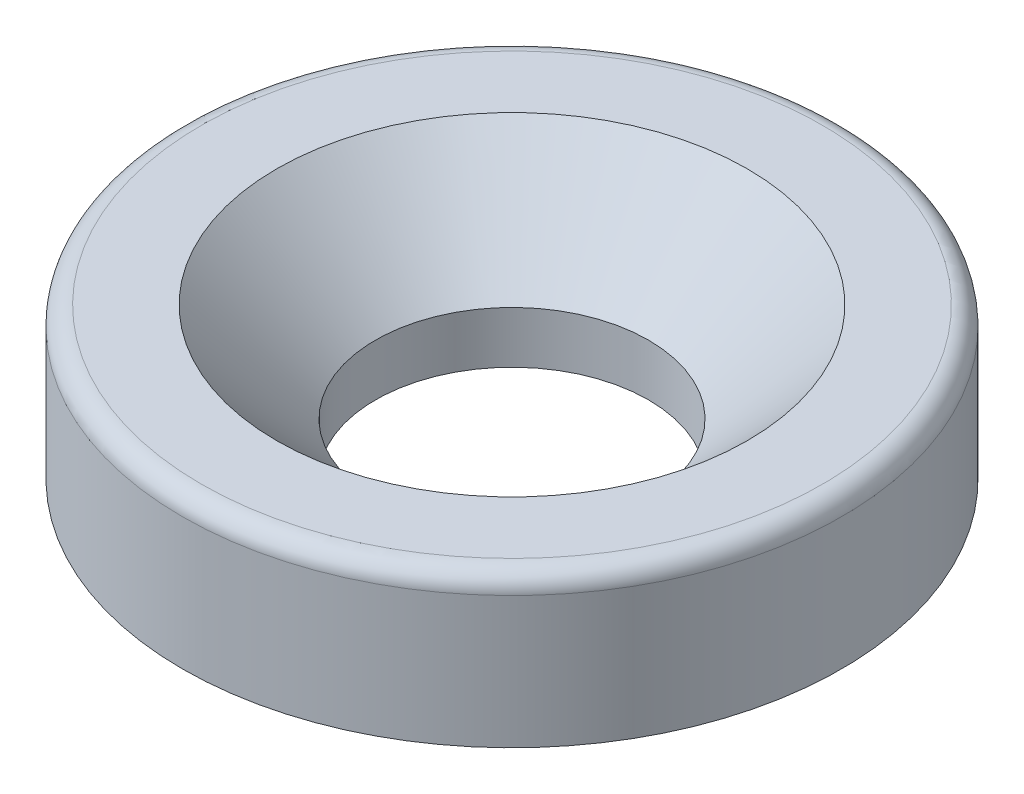
ISO-10303-21;
HEADER;
FILE_DESCRIPTION(('STEP AP214'),'2;1');
FILE_NAME('part.step','',(''),(''),'','','');
FILE_SCHEMA(('AUTOMOTIVE_DESIGN { 1 0 10303 214 1 1 1 1 }'));
ENDSEC;
DATA;
#1=APPLICATION_CONTEXT('core data for automotive mechanical design processes');
#2=APPLICATION_PROTOCOL_DEFINITION('international standard','automotive_design',2000,#1);
#3=PRODUCT_CONTEXT('',#1,'mechanical');
#4=PRODUCT('Part','Part','',(#3));
#5=PRODUCT_RELATED_PRODUCT_CATEGORY('part','',(#4));
#6=PRODUCT_DEFINITION_FORMATION('','',#4);
#7=PRODUCT_DEFINITION_CONTEXT('part definition',#1,'design');
#8=PRODUCT_DEFINITION('design','',#6,#7);
#9=PRODUCT_DEFINITION_SHAPE('','',#8);
#10=(LENGTH_UNIT() NAMED_UNIT(*) SI_UNIT(.MILLI.,.METRE.));
#11=(NAMED_UNIT(*) PLANE_ANGLE_UNIT() SI_UNIT($,.RADIAN.));
#12=(NAMED_UNIT(*) SI_UNIT($,.STERADIAN.) SOLID_ANGLE_UNIT());
#13=UNCERTAINTY_MEASURE_WITH_UNIT(LENGTH_MEASURE(1.E-05),#10,'distance_accuracy_value','');
#14=(GEOMETRIC_REPRESENTATION_CONTEXT(3) GLOBAL_UNCERTAINTY_ASSIGNED_CONTEXT((#13)) GLOBAL_UNIT_ASSIGNED_CONTEXT((#10,
#11,#12)) REPRESENTATION_CONTEXT('',''));
#15=CARTESIAN_POINT('',(0.,0.,0.));
#16=DIRECTION('',(0.,0.,1.));
#17=DIRECTION('',(1.,0.,0.));
#18=AXIS2_PLACEMENT_3D('',#15,#16,#17);
#19=CARTESIAN_POINT('',(0.,8.,0.));
#20=DIRECTION('',(0.,1.,0.));
#21=DIRECTION('',(0.,0.,1.));
#22=AXIS2_PLACEMENT_3D('',#19,#20,#21);
#23=PLANE('',#22);
#24=CARTESIAN_POINT('',(0.,8.,0.));
#25=DIRECTION('',(0.,1.,0.));
#26=DIRECTION('',(0.,0.,1.));
#27=AXIS2_PLACEMENT_3D('',#24,#25,#26);
#28=CIRCLE('',#27,16.5);
#29=CARTESIAN_POINT('',(0.,8.,16.5));
#30=VERTEX_POINT('',#29);
#31=EDGE_CURVE('E10',#30,#30,#28,.T.);
#32=ORIENTED_EDGE('',*,*,#31,.T.);
#33=EDGE_LOOP('',(#32));
#34=FACE_BOUND('',#33,.T.);
#35=CARTESIAN_POINT('',(0.,8.,0.));
#36=DIRECTION('',(0.,1.,0.));
#37=DIRECTION('',(0.,0.,1.));
#38=AXIS2_PLACEMENT_3D('',#35,#36,#37);
#39=CIRCLE('',#38,12.5);
#40=CARTESIAN_POINT('',(0.,8.,12.5));
#41=VERTEX_POINT('',#40);
#42=EDGE_CURVE('E54',#41,#41,#39,.T.);
#43=ORIENTED_EDGE('',*,*,#42,.F.);
#44=EDGE_LOOP('',(#43));
#45=FACE_BOUND('',#44,.T.);
#46=ADVANCED_FACE('F31',(#34,#45),#23,.T.);
#47=CARTESIAN_POINT('',(0.,0.,0.));
#48=DIRECTION('',(0.,-1.,0.));
#49=DIRECTION('',(0.,0.,-1.));
#50=AXIS2_PLACEMENT_3D('',#47,#48,#49);
#51=CYLINDRICAL_SURFACE('',#50,17.5);
#52=CARTESIAN_POINT('',(0.,7.,0.));
#53=DIRECTION('',(0.,1.,0.));
#54=DIRECTION('',(0.,0.,1.));
#55=AXIS2_PLACEMENT_3D('',#52,#53,#54);
#56=CIRCLE('',#55,17.5);
#57=CARTESIAN_POINT('',(0.,7.,17.5));
#58=VERTEX_POINT('',#57);
#59=EDGE_CURVE('E38',#58,#58,#56,.F.);
#60=ORIENTED_EDGE('',*,*,#59,.T.);
#61=EDGE_LOOP('',(#60));
#62=FACE_BOUND('',#61,.T.);
#63=CARTESIAN_POINT('',(0.,0.,0.));
#64=DIRECTION('',(0.,-1.,0.));
#65=DIRECTION('',(0.,0.,-1.));
#66=AXIS2_PLACEMENT_3D('',#63,#64,#65);
#67=CIRCLE('',#66,17.5);
#68=CARTESIAN_POINT('',(0.,0.,-17.5));
#69=VERTEX_POINT('',#68);
#70=EDGE_CURVE('E42',#69,#69,#67,.T.);
#71=ORIENTED_EDGE('',*,*,#70,.F.);
#72=EDGE_LOOP('',(#71));
#73=FACE_BOUND('',#72,.T.);
#74=ADVANCED_FACE('F61',(#62,#73),#51,.T.);
#75=CARTESIAN_POINT('',(0.,0.,0.));
#76=DIRECTION('',(0.,-1.,0.));
#77=DIRECTION('',(0.,0.,-1.));
#78=AXIS2_PLACEMENT_3D('',#75,#76,#77);
#79=PLANE('',#78);
#80=CARTESIAN_POINT('',(0.,0.,0.));
#81=DIRECTION('',(0.,1.,0.));
#82=DIRECTION('',(0.,0.,1.));
#83=AXIS2_PLACEMENT_3D('',#80,#81,#82);
#84=CIRCLE('',#83,7.24999999999999);
#85=CARTESIAN_POINT('',(0.,0.,7.24999999999999));
#86=VERTEX_POINT('',#85);
#87=EDGE_CURVE('E46',#86,#86,#84,.T.);
#88=ORIENTED_EDGE('',*,*,#87,.T.);
#89=EDGE_LOOP('',(#88));
#90=FACE_BOUND('',#89,.T.);
#91=ORIENTED_EDGE('',*,*,#70,.T.);
#92=EDGE_LOOP('',(#91));
#93=FACE_BOUND('',#92,.T.);
#94=ADVANCED_FACE('F65',(#90,#93),#79,.T.);
#95=CARTESIAN_POINT('',(0.,8.,0.));
#96=DIRECTION('',(0.,1.,0.));
#97=DIRECTION('',(0.,0.,1.));
#98=AXIS2_PLACEMENT_3D('',#95,#96,#97);
#99=CYLINDRICAL_SURFACE('',#98,7.24999999999999);
#100=ORIENTED_EDGE('',*,*,#87,.F.);
#101=EDGE_LOOP('',(#100));
#102=FACE_BOUND('',#101,.T.);
#103=CARTESIAN_POINT('',(0.,2.75,0.));
#104=DIRECTION('',(0.,1.,0.));
#105=DIRECTION('',(0.,0.,1.));
#106=AXIS2_PLACEMENT_3D('',#103,#104,#105);
#107=CIRCLE('',#106,7.24999999999999);
#108=CARTESIAN_POINT('',(0.,2.75,7.24999999999999));
#109=VERTEX_POINT('',#108);
#110=EDGE_CURVE('E51',#109,#109,#107,.T.);
#111=ORIENTED_EDGE('',*,*,#110,.T.);
#112=EDGE_LOOP('',(#111));
#113=FACE_BOUND('',#112,.T.);
#114=ADVANCED_FACE('F70',(#102,#113),#99,.F.);
#115=CARTESIAN_POINT('',(0.,8.,0.));
#116=DIRECTION('',(0.,1.,0.));
#117=DIRECTION('',(0.,0.,1.));
#118=AXIS2_PLACEMENT_3D('',#115,#116,#117);
#119=CONICAL_SURFACE('',#118,12.5,0.785398163397449);
#120=ORIENTED_EDGE('',*,*,#110,.F.);
#121=EDGE_LOOP('',(#120));
#122=FACE_BOUND('',#121,.T.);
#123=ORIENTED_EDGE('',*,*,#42,.T.);
#124=EDGE_LOOP('',(#123));
#125=FACE_BOUND('',#124,.T.);
#126=ADVANCED_FACE('F58',(#122,#125),#119,.F.);
#127=CARTESIAN_POINT('',(0.,7.,0.));
#128=DIRECTION('',(0.,1.,0.));
#129=DIRECTION('',(0.,0.,1.));
#130=AXIS2_PLACEMENT_3D('',#127,#128,#129);
#131=TOROIDAL_SURFACE('',#130,16.5,1.);
#132=ORIENTED_EDGE('',*,*,#31,.F.);
#133=EDGE_LOOP('',(#132));
#134=FACE_BOUND('',#133,.T.);
#135=ORIENTED_EDGE('',*,*,#59,.F.);
#136=EDGE_LOOP('',(#135));
#137=FACE_BOUND('',#136,.T.);
#138=ADVANCED_FACE('F33',(#134,#137),#131,.T.);
#139=CLOSED_SHELL('',(#46,#74,#94,#114,#126,#138));
#140=MANIFOLD_SOLID_BREP('B2',#139);
#141=ADVANCED_BREP_SHAPE_REPRESENTATION('',(#18,#140),#14);
#142=SHAPE_DEFINITION_REPRESENTATION(#9,#141);
ENDSEC;
END-ISO-10303-21;
